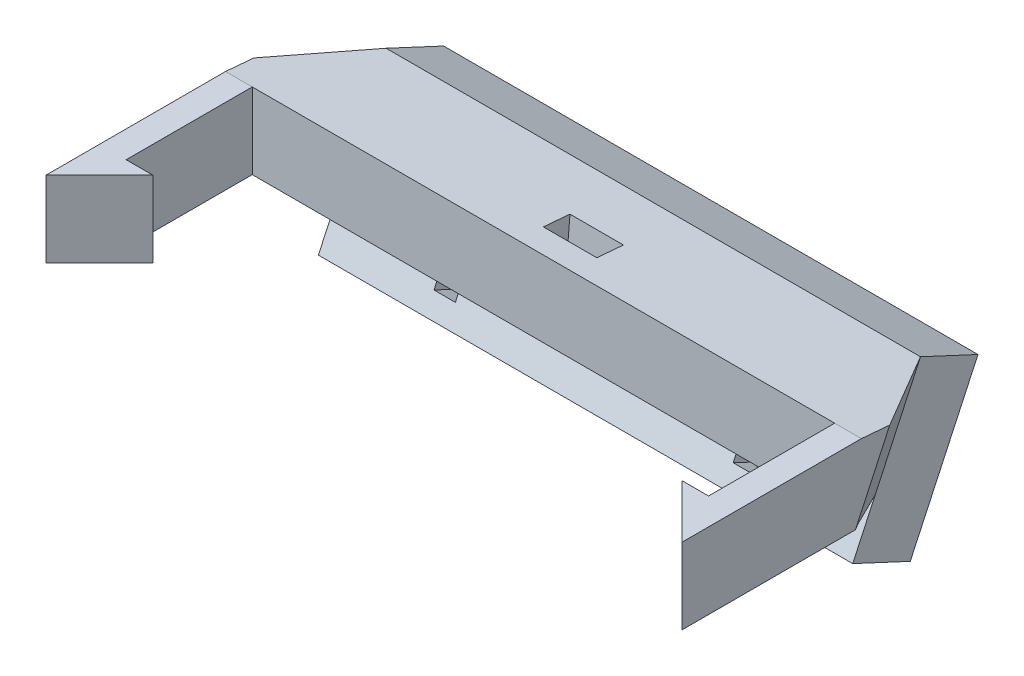
ISO-10303-21;
HEADER;
FILE_DESCRIPTION(('STEP AP214'),'2;1');
FILE_NAME('part.step','',(''),(''),'','','');
FILE_SCHEMA(('AUTOMOTIVE_DESIGN { 1 0 10303 214 1 1 1 1 }'));
ENDSEC;
DATA;
#1=APPLICATION_CONTEXT('core data for automotive mechanical design processes');
#2=APPLICATION_PROTOCOL_DEFINITION('international standard','automotive_design',2000,#1);
#3=PRODUCT_CONTEXT('',#1,'mechanical');
#4=PRODUCT('Part','Part','',(#3));
#5=PRODUCT_RELATED_PRODUCT_CATEGORY('part','',(#4));
#6=PRODUCT_DEFINITION_FORMATION('','',#4);
#7=PRODUCT_DEFINITION_CONTEXT('part definition',#1,'design');
#8=PRODUCT_DEFINITION('design','',#6,#7);
#9=PRODUCT_DEFINITION_SHAPE('','',#8);
#10=(LENGTH_UNIT() NAMED_UNIT(*) SI_UNIT(.MILLI.,.METRE.));
#11=(NAMED_UNIT(*) PLANE_ANGLE_UNIT() SI_UNIT($,.RADIAN.));
#12=(NAMED_UNIT(*) SI_UNIT($,.STERADIAN.) SOLID_ANGLE_UNIT());
#13=UNCERTAINTY_MEASURE_WITH_UNIT(LENGTH_MEASURE(1.E-05),#10,'distance_accuracy_value','');
#14=(GEOMETRIC_REPRESENTATION_CONTEXT(3) GLOBAL_UNCERTAINTY_ASSIGNED_CONTEXT((#13)) GLOBAL_UNIT_ASSIGNED_CONTEXT((#10,
#11,#12)) REPRESENTATION_CONTEXT('',''));
#15=CARTESIAN_POINT('',(0.,0.,0.));
#16=DIRECTION('',(0.,0.,1.));
#17=DIRECTION('',(1.,0.,0.));
#18=AXIS2_PLACEMENT_3D('',#15,#16,#17);
#19=CARTESIAN_POINT('',(37.7825,3.39860036747243,-13.0507435403567));
#20=DIRECTION('',(0.,-0.996366443360063,0.0851698922508354));
#21=DIRECTION('',(0.,-0.0851698922508354,-0.996366443360063));
#22=AXIS2_PLACEMENT_3D('',#19,#20,#21);
#23=PLANE('',#22);
#24=DIRECTION('',(0.,0.0851698922508354,0.996366443360063));
#25=VECTOR('',#24,1.);
#26=CARTESIAN_POINT('',(37.7825,3.39860036747243,-13.0507435403567));
#27=LINE('',#26,#25);
#28=CARTESIAN_POINT('',(37.7825,4.22620582678409,-3.36893831309177));
#29=VERTEX_POINT('',#28);
#30=CARTESIAN_POINT('',(37.7825,4.51418432609816,0.));
#31=VERTEX_POINT('',#30);
#32=EDGE_CURVE('E332',#29,#31,#27,.T.);
#33=ORIENTED_EDGE('',*,*,#32,.F.);
#34=DIRECTION('',(-0.527437876420652,-0.0723597954369629,-0.846506554328549));
#35=VECTOR('',#34,1.);
#36=CARTESIAN_POINT('',(33.428185479087,3.62883252068087,-10.3573552363792));
#37=LINE('',#36,#35);
#38=CARTESIAN_POINT('',(31.75,3.39860036747242,-13.0507435403567));
#39=VERTEX_POINT('',#38);
#40=EDGE_CURVE('E384',#29,#39,#37,.T.);
#41=ORIENTED_EDGE('',*,*,#40,.T.);
#42=DIRECTION('',(1.,0.,0.));
#43=VECTOR('',#42,1.);
#44=CARTESIAN_POINT('',(37.7825,3.39860036747242,-13.0507435403567));
#45=LINE('',#44,#43);
#46=CARTESIAN_POINT('',(-31.75,3.39860036747242,-13.0507435403567));
#47=VERTEX_POINT('',#46);
#48=EDGE_CURVE('E324',#47,#39,#45,.T.);
#49=ORIENTED_EDGE('',*,*,#48,.F.);
#50=DIRECTION('',(-0.527437876420653,0.0723597954369629,0.846506554328549));
#51=VECTOR('',#50,1.);
#52=CARTESIAN_POINT('',(-12.4067042147344,0.744871864701444,-44.0955876756763));
#53=LINE('',#52,#51);
#54=CARTESIAN_POINT('',(-37.7825,4.22620582678409,-3.36893831309177));
#55=VERTEX_POINT('',#54);
#56=EDGE_CURVE('E369',#47,#55,#53,.T.);
#57=ORIENTED_EDGE('',*,*,#56,.T.);
#58=DIRECTION('',(0.,0.0851698922508354,0.996366443360063));
#59=VECTOR('',#58,1.);
#60=CARTESIAN_POINT('',(-37.7825,3.39860036747243,-13.0507435403567));
#61=LINE('',#60,#59);
#62=CARTESIAN_POINT('',(-37.7825,4.51418432609816,0.));
#63=VERTEX_POINT('',#62);
#64=EDGE_CURVE('E333',#55,#63,#61,.T.);
#65=ORIENTED_EDGE('',*,*,#64,.T.);
#66=DIRECTION('',(-1.,0.,0.));
#67=VECTOR('',#66,1.);
#68=CARTESIAN_POINT('',(-37.7825,4.51418432609816,0.));
#69=LINE('',#68,#67);
#70=CARTESIAN_POINT('',(-34.6075,4.51418432609816,0.));
#71=VERTEX_POINT('',#70);
#72=EDGE_CURVE('E257',#71,#63,#69,.T.);
#73=ORIENTED_EDGE('',*,*,#72,.F.);
#74=DIRECTION('',(-1.,0.,0.));
#75=VECTOR('',#74,1.);
#76=CARTESIAN_POINT('',(37.7825,4.51418432609816,0.));
#77=LINE('',#76,#75);
#78=CARTESIAN_POINT('',(34.6075,4.51418432609816,0.));
#79=VERTEX_POINT('',#78);
#80=EDGE_CURVE('E327',#79,#71,#77,.T.);
#81=ORIENTED_EDGE('',*,*,#80,.F.);
#82=DIRECTION('',(-1.,0.,0.));
#83=VECTOR('',#82,1.);
#84=CARTESIAN_POINT('',(37.7825,4.51418432609816,0.));
#85=LINE('',#84,#83);
#86=EDGE_CURVE('E286',#31,#79,#85,.T.);
#87=ORIENTED_EDGE('',*,*,#86,.F.);
#88=EDGE_LOOP('',(#33,#41,#49,#57,#65,#73,#81,#87));
#89=FACE_BOUND('',#88,.T.);
#90=DIRECTION('',(0.,0.0851698922508354,0.996366443360063));
#91=VECTOR('',#90,1.);
#92=CARTESIAN_POINT('',(-3.175,3.39860036747242,-13.0507435403567));
#93=LINE('',#92,#91);
#94=CARTESIAN_POINT('',(-3.175,3.97335551030536,-6.3269269153364));
#95=VERTEX_POINT('',#94);
#96=CARTESIAN_POINT('',(-3.175,4.24376991820176,-3.1634634576682));
#97=VERTEX_POINT('',#96);
#98=EDGE_CURVE('E339',#95,#97,#93,.T.);
#99=ORIENTED_EDGE('',*,*,#98,.F.);
#100=DIRECTION('',(-1.,0.,0.));
#101=VECTOR('',#100,1.);
#102=CARTESIAN_POINT('',(37.7825,3.97335551030536,-6.3269269153364));
#103=LINE('',#102,#101);
#104=CARTESIAN_POINT('',(3.175,3.97335551030536,-6.3269269153364));
#105=VERTEX_POINT('',#104);
#106=EDGE_CURVE('E347',#105,#95,#103,.T.);
#107=ORIENTED_EDGE('',*,*,#106,.F.);
#108=DIRECTION('',(0.,-0.0851698922508354,-0.996366443360063));
#109=VECTOR('',#108,1.);
#110=CARTESIAN_POINT('',(3.175,3.39860036747243,-13.0507435403567));
#111=LINE('',#110,#109);
#112=CARTESIAN_POINT('',(3.175,4.24376991820176,-3.1634634576682));
#113=VERTEX_POINT('',#112);
#114=EDGE_CURVE('E344',#113,#105,#111,.T.);
#115=ORIENTED_EDGE('',*,*,#114,.F.);
#116=DIRECTION('',(1.,0.,0.));
#117=VECTOR('',#116,1.);
#118=CARTESIAN_POINT('',(37.7825,4.24376991820176,-3.1634634576682));
#119=LINE('',#118,#117);
#120=EDGE_CURVE('E342',#97,#113,#119,.T.);
#121=ORIENTED_EDGE('',*,*,#120,.F.);
#122=EDGE_LOOP('',(#99,#107,#115,#121));
#123=FACE_BOUND('',#122,.T.);
#124=ADVANCED_FACE('F33',(#89,#123),#23,.F.);
#125=CARTESIAN_POINT('',(37.7825,-8.09963674271568,-7.68902752059396));
#126=DIRECTION('',(0.,0.906307787036649,-0.422618261740701));
#127=DIRECTION('',(0.,0.422618261740701,0.906307787036649));
#128=AXIS2_PLACEMENT_3D('',#125,#126,#127);
#129=PLANE('',#128);
#130=DIRECTION('',(-1.,0.,0.));
#131=VECTOR('',#130,1.);
#132=CARTESIAN_POINT('',(37.7825,-8.09963674271568,-7.68902752059396));
#133=LINE('',#132,#131);
#134=CARTESIAN_POINT('',(31.75,-8.09963674271568,-7.68902752059396));
#135=VERTEX_POINT('',#134);
#136=CARTESIAN_POINT('',(-31.75,-8.09963674271568,-7.68902752059397));
#137=VERTEX_POINT('',#136);
#138=EDGE_CURVE('E241',#135,#137,#133,.T.);
#139=ORIENTED_EDGE('',*,*,#138,.F.);
#140=DIRECTION('',(0.551501692364503,0.352537069873648,0.756018186080198));
#141=VECTOR('',#140,1.);
#142=CARTESIAN_POINT('',(33.5848097088776,-6.9267691930801,-5.17380494355938));
#143=LINE('',#142,#141);
#144=CARTESIAN_POINT('',(37.3590075190268,-4.51418432609816,0.));
#145=VERTEX_POINT('',#144);
#146=EDGE_CURVE('E387',#135,#145,#143,.T.);
#147=ORIENTED_EDGE('',*,*,#146,.T.);
#148=DIRECTION('',(1.,0.,0.));
#149=VECTOR('',#148,1.);
#150=CARTESIAN_POINT('',(37.7825,-4.51418432609816,0.));
#151=LINE('',#150,#149);
#152=CARTESIAN_POINT('',(34.6075,-4.51418432609816,0.));
#153=VERTEX_POINT('',#152);
#154=EDGE_CURVE('E280',#153,#145,#151,.T.);
#155=ORIENTED_EDGE('',*,*,#154,.F.);
#156=DIRECTION('',(-1.,0.,0.));
#157=VECTOR('',#156,1.);
#158=CARTESIAN_POINT('',(37.7825,-4.51418432609816,0.));
#159=LINE('',#158,#157);
#160=CARTESIAN_POINT('',(-34.6075,-4.51418432609816,0.));
#161=VERTEX_POINT('',#160);
#162=EDGE_CURVE('E336',#153,#161,#159,.T.);
#163=ORIENTED_EDGE('',*,*,#162,.T.);
#164=DIRECTION('',(1.,0.,0.));
#165=VECTOR('',#164,1.);
#166=CARTESIAN_POINT('',(-37.7825,-4.51418432609816,0.));
#167=LINE('',#166,#165);
#168=CARTESIAN_POINT('',(-37.3590075190268,-4.51418432609816,0.));
#169=VERTEX_POINT('',#168);
#170=EDGE_CURVE('E263',#169,#161,#167,.T.);
#171=ORIENTED_EDGE('',*,*,#170,.F.);
#172=DIRECTION('',(0.551501692364503,-0.352537069873648,-0.756018186080197));
#173=VECTOR('',#172,1.);
#174=CARTESIAN_POINT('',(-10.6014038818846,-21.6184784990415,-36.6802772243083));
#175=LINE('',#174,#173);
#176=EDGE_CURVE('E372',#169,#137,#175,.T.);
#177=ORIENTED_EDGE('',*,*,#176,.T.);
#178=EDGE_LOOP('',(#139,#147,#155,#163,#171,#177));
#179=FACE_BOUND('',#178,.T.);
#180=DIRECTION('',(0.,-0.422618261740701,-0.906307787036649));
#181=VECTOR('',#180,1.);
#182=CARTESIAN_POINT('',(-3.175,-9.3759769667585,-10.4261479639785));
#183=LINE('',#182,#181);
#184=CARTESIAN_POINT('',(-3.175,-5.59707350368473,-2.32226333547929));
#185=VERTEX_POINT('',#184);
#186=CARTESIAN_POINT('',(-3.175,-7.02604059032113,-5.38669314195141));
#187=VERTEX_POINT('',#186);
#188=EDGE_CURVE('E361',#185,#187,#183,.T.);
#189=ORIENTED_EDGE('',*,*,#188,.F.);
#190=DIRECTION('',(-1.,0.,0.));
#191=VECTOR('',#190,1.);
#192=CARTESIAN_POINT('',(-3.175,-5.59707350368473,-2.32226333547929));
#193=LINE('',#192,#191);
#194=CARTESIAN_POINT('',(3.175,-5.59707350368473,-2.32226333547929));
#195=VERTEX_POINT('',#194);
#196=EDGE_CURVE('E358',#195,#185,#193,.T.);
#197=ORIENTED_EDGE('',*,*,#196,.F.);
#198=DIRECTION('',(0.,0.422618261740701,0.906307787036649));
#199=VECTOR('',#198,1.);
#200=CARTESIAN_POINT('',(3.175,-9.3759769667585,-10.4261479639785));
#201=LINE('',#200,#199);
#202=CARTESIAN_POINT('',(3.175,-7.02604059032113,-5.38669314195141));
#203=VERTEX_POINT('',#202);
#204=EDGE_CURVE('E366',#203,#195,#201,.T.);
#205=ORIENTED_EDGE('',*,*,#204,.F.);
#206=DIRECTION('',(1.,0.,0.));
#207=VECTOR('',#206,1.);
#208=CARTESIAN_POINT('',(-3.175,-7.02604059032113,-5.38669314195141));
#209=LINE('',#208,#207);
#210=EDGE_CURVE('E363',#187,#203,#209,.T.);
#211=ORIENTED_EDGE('',*,*,#210,.F.);
#212=EDGE_LOOP('',(#189,#197,#205,#211));
#213=FACE_BOUND('',#212,.T.);
#214=ADVANCED_FACE('F495',(#179,#213),#129,.F.);
#215=CARTESIAN_POINT('',(0.,0.,0.));
#216=DIRECTION('',(0.,0.,1.));
#217=DIRECTION('',(1.,0.,0.));
#218=AXIS2_PLACEMENT_3D('',#215,#216,#217);
#219=PLANE('',#218);
#220=ORIENTED_EDGE('',*,*,#162,.F.);
#221=DIRECTION('',(0.,-1.,0.));
#222=VECTOR('',#221,1.);
#223=CARTESIAN_POINT('',(34.6075,4.51418432609816,0.));
#224=LINE('',#223,#222);
#225=EDGE_CURVE('E283',#79,#153,#224,.T.);
#226=ORIENTED_EDGE('',*,*,#225,.F.);
#227=ORIENTED_EDGE('',*,*,#80,.T.);
#228=DIRECTION('',(0.,1.,0.));
#229=VECTOR('',#228,1.);
#230=CARTESIAN_POINT('',(-34.6075,4.51418432609816,0.));
#231=LINE('',#230,#229);
#232=EDGE_CURVE('E260',#161,#71,#231,.T.);
#233=ORIENTED_EDGE('',*,*,#232,.F.);
#234=EDGE_LOOP('',(#220,#226,#227,#233));
#235=FACE_BOUND('',#234,.T.);
#236=ADVANCED_FACE('F501',(#235),#219,.T.);
#237=CARTESIAN_POINT('',(-37.7825,17.78,-3.175));
#238=DIRECTION('',(-1.,0.,0.));
#239=DIRECTION('',(0.,0.,1.));
#240=AXIS2_PLACEMENT_3D('',#237,#238,#239);
#241=PLANE('',#240);
#242=DIRECTION('',(0.,0.906307787036649,-0.422618261740701));
#243=VECTOR('',#242,1.);
#244=CARTESIAN_POINT('',(-37.7825,-25.9312942503124,10.6937349236683));
#245=LINE('',#244,#243);
#246=CARTESIAN_POINT('',(-37.7825,-4.51418432609816,0.706772550459773));
#247=VERTEX_POINT('',#246);
#248=EDGE_CURVE('E377',#247,#55,#245,.T.);
#249=ORIENTED_EDGE('',*,*,#248,.F.);
#250=DIRECTION('',(0.,0.,-1.));
#251=VECTOR('',#250,1.);
#252=CARTESIAN_POINT('',(-37.7825,-4.51418432609816,14.986));
#253=LINE('',#252,#251);
#254=CARTESIAN_POINT('',(-37.7825,-4.51418432609816,21.336));
#255=VERTEX_POINT('',#254);
#256=EDGE_CURVE('E243',#255,#247,#253,.T.);
#257=ORIENTED_EDGE('',*,*,#256,.F.);
#258=DIRECTION('',(0.,-1.,0.));
#259=VECTOR('',#258,1.);
#260=CARTESIAN_POINT('',(-37.7825,13.4944404471673,21.336));
#261=LINE('',#260,#259);
#262=CARTESIAN_POINT('',(-37.7825,4.51418432609816,21.336));
#263=VERTEX_POINT('',#262);
#264=EDGE_CURVE('E298',#263,#255,#261,.T.);
#265=ORIENTED_EDGE('',*,*,#264,.F.);
#266=DIRECTION('',(0.,0.,-1.));
#267=VECTOR('',#266,1.);
#268=CARTESIAN_POINT('',(-37.7825,4.51418432609816,14.986));
#269=LINE('',#268,#267);
#270=EDGE_CURVE('E253',#263,#63,#269,.T.);
#271=ORIENTED_EDGE('',*,*,#270,.T.);
#272=ORIENTED_EDGE('',*,*,#64,.F.);
#273=EDGE_LOOP('',(#249,#257,#265,#271,#272));
#274=FACE_BOUND('',#273,.T.);
#275=ADVANCED_FACE('F35',(#274),#241,.T.);
#276=CARTESIAN_POINT('',(37.7825,17.78,-3.175));
#277=DIRECTION('',(1.,0.,0.));
#278=DIRECTION('',(0.,0.,-1.));
#279=AXIS2_PLACEMENT_3D('',#276,#277,#278);
#280=PLANE('',#279);
#281=DIRECTION('',(0.,0.906307787036649,-0.422618261740701));
#282=VECTOR('',#281,1.);
#283=CARTESIAN_POINT('',(37.7825,-25.9312942503124,10.6937349236683));
#284=LINE('',#283,#282);
#285=CARTESIAN_POINT('',(37.7825,-4.51418432609816,0.706772550459773));
#286=VERTEX_POINT('',#285);
#287=EDGE_CURVE('E394',#286,#29,#284,.T.);
#288=ORIENTED_EDGE('',*,*,#287,.T.);
#289=ORIENTED_EDGE('',*,*,#32,.T.);
#290=DIRECTION('',(0.,0.,-1.));
#291=VECTOR('',#290,1.);
#292=CARTESIAN_POINT('',(37.7825,4.51418432609816,14.986));
#293=LINE('',#292,#291);
#294=CARTESIAN_POINT('',(37.7825,4.51418432609816,21.336));
#295=VERTEX_POINT('',#294);
#296=EDGE_CURVE('E265',#295,#31,#293,.T.);
#297=ORIENTED_EDGE('',*,*,#296,.F.);
#298=DIRECTION('',(0.,-1.,0.));
#299=VECTOR('',#298,1.);
#300=CARTESIAN_POINT('',(37.7825,13.4944404471673,21.336));
#301=LINE('',#300,#299);
#302=CARTESIAN_POINT('',(37.7825,-4.51418432609816,21.336));
#303=VERTEX_POINT('',#302);
#304=EDGE_CURVE('E311',#295,#303,#301,.T.);
#305=ORIENTED_EDGE('',*,*,#304,.T.);
#306=DIRECTION('',(0.,0.,-1.));
#307=VECTOR('',#306,1.);
#308=CARTESIAN_POINT('',(37.7825,-4.51418432609816,14.986));
#309=LINE('',#308,#307);
#310=EDGE_CURVE('E276',#303,#286,#309,.T.);
#311=ORIENTED_EDGE('',*,*,#310,.T.);
#312=EDGE_LOOP('',(#288,#289,#297,#305,#311));
#313=FACE_BOUND('',#312,.T.);
#314=ADVANCED_FACE('F553',(#313),#280,.T.);
#315=CARTESIAN_POINT('',(-37.7825,-4.51418432609816,14.986));
#316=DIRECTION('',(0.,1.,0.));
#317=DIRECTION('',(0.,0.,1.));
#318=AXIS2_PLACEMENT_3D('',#315,#316,#317);
#319=PLANE('',#318);
#320=ORIENTED_EDGE('',*,*,#256,.T.);
#321=DIRECTION('',(0.513986051768902,0.,-0.857798541959017));
#322=VECTOR('',#321,1.);
#323=CARTESIAN_POINT('',(-44.0781612023646,-4.51418432609816,11.2136899686866));
#324=LINE('',#323,#322);
#325=EDGE_CURVE('E374',#247,#169,#324,.T.);
#326=ORIENTED_EDGE('',*,*,#325,.T.);
#327=ORIENTED_EDGE('',*,*,#170,.T.);
#328=DIRECTION('',(0.,0.,-1.));
#329=VECTOR('',#328,1.);
#330=CARTESIAN_POINT('',(-34.6075,-4.51418432609816,14.986));
#331=LINE('',#330,#329);
#332=CARTESIAN_POINT('',(-34.6075,-4.51418432609816,14.986));
#333=VERTEX_POINT('',#332);
#334=EDGE_CURVE('E245',#333,#161,#331,.T.);
#335=ORIENTED_EDGE('',*,*,#334,.F.);
#336=DIRECTION('',(1.,0.,0.));
#337=VECTOR('',#336,1.);
#338=CARTESIAN_POINT('',(-37.7825,-4.51418432609816,14.986));
#339=LINE('',#338,#337);
#340=CARTESIAN_POINT('',(-31.4325,-4.51418432609816,14.986));
#341=VERTEX_POINT('',#340);
#342=EDGE_CURVE('E304',#333,#341,#339,.T.);
#343=ORIENTED_EDGE('',*,*,#342,.T.);
#344=DIRECTION('',(-0.707106781186547,0.,0.707106781186547));
#345=VECTOR('',#344,1.);
#346=CARTESIAN_POINT('',(-31.4325,-4.51418432609816,14.986));
#347=LINE('',#346,#345);
#348=EDGE_CURVE('E299',#341,#255,#347,.T.);
#349=ORIENTED_EDGE('',*,*,#348,.T.);
#350=EDGE_LOOP('',(#320,#326,#327,#335,#343,#349));
#351=FACE_BOUND('',#350,.T.);
#352=ADVANCED_FACE('F549',(#351),#319,.F.);
#353=CARTESIAN_POINT('',(-34.6075,4.51418432609816,14.986));
#354=DIRECTION('',(-1.,0.,0.));
#355=DIRECTION('',(0.,0.,1.));
#356=AXIS2_PLACEMENT_3D('',#353,#354,#355);
#357=PLANE('',#356);
#358=ORIENTED_EDGE('',*,*,#232,.T.);
#359=DIRECTION('',(0.,0.,-1.));
#360=VECTOR('',#359,1.);
#361=CARTESIAN_POINT('',(-34.6075,4.51418432609816,14.986));
#362=LINE('',#361,#360);
#363=CARTESIAN_POINT('',(-34.6075,4.51418432609816,14.986));
#364=VERTEX_POINT('',#363);
#365=EDGE_CURVE('E250',#364,#71,#362,.T.);
#366=ORIENTED_EDGE('',*,*,#365,.F.);
#367=DIRECTION('',(0.,1.,0.));
#368=VECTOR('',#367,1.);
#369=CARTESIAN_POINT('',(-34.6075,4.51418432609816,14.986));
#370=LINE('',#369,#368);
#371=EDGE_CURVE('E256',#333,#364,#370,.T.);
#372=ORIENTED_EDGE('',*,*,#371,.F.);
#373=ORIENTED_EDGE('',*,*,#334,.T.);
#374=EDGE_LOOP('',(#358,#366,#372,#373));
#375=FACE_BOUND('',#374,.T.);
#376=ADVANCED_FACE('F545',(#375),#357,.F.);
#377=CARTESIAN_POINT('',(-37.7825,4.51418432609816,14.986));
#378=DIRECTION('',(0.,-1.,0.));
#379=DIRECTION('',(0.,0.,-1.));
#380=AXIS2_PLACEMENT_3D('',#377,#378,#379);
#381=PLANE('',#380);
#382=ORIENTED_EDGE('',*,*,#72,.T.);
#383=ORIENTED_EDGE('',*,*,#270,.F.);
#384=DIRECTION('',(0.707106781186548,0.,-0.707106781186548));
#385=VECTOR('',#384,1.);
#386=CARTESIAN_POINT('',(-31.4325,4.51418432609816,14.986));
#387=LINE('',#386,#385);
#388=CARTESIAN_POINT('',(-31.4325,4.51418432609816,14.986));
#389=VERTEX_POINT('',#388);
#390=EDGE_CURVE('E294',#263,#389,#387,.T.);
#391=ORIENTED_EDGE('',*,*,#390,.T.);
#392=DIRECTION('',(-1.,0.,0.));
#393=VECTOR('',#392,1.);
#394=CARTESIAN_POINT('',(-37.7825,4.51418432609816,14.986));
#395=LINE('',#394,#393);
#396=EDGE_CURVE('E289',#389,#364,#395,.T.);
#397=ORIENTED_EDGE('',*,*,#396,.T.);
#398=ORIENTED_EDGE('',*,*,#365,.T.);
#399=EDGE_LOOP('',(#382,#383,#391,#397,#398));
#400=FACE_BOUND('',#399,.T.);
#401=ADVANCED_FACE('F541',(#400),#381,.F.);
#402=CARTESIAN_POINT('',(37.7825,4.51418432609816,14.986));
#403=DIRECTION('',(0.,-1.,0.));
#404=DIRECTION('',(1.,0.,0.));
#405=AXIS2_PLACEMENT_3D('',#402,#403,#404);
#406=PLANE('',#405);
#407=ORIENTED_EDGE('',*,*,#86,.T.);
#408=DIRECTION('',(0.,0.,-1.));
#409=VECTOR('',#408,1.);
#410=CARTESIAN_POINT('',(34.6075,4.51418432609816,14.986));
#411=LINE('',#410,#409);
#412=CARTESIAN_POINT('',(34.6075,4.51418432609816,14.986));
#413=VERTEX_POINT('',#412);
#414=EDGE_CURVE('E270',#413,#79,#411,.T.);
#415=ORIENTED_EDGE('',*,*,#414,.F.);
#416=DIRECTION('',(-1.,0.,0.));
#417=VECTOR('',#416,1.);
#418=CARTESIAN_POINT('',(37.7825,4.51418432609816,14.986));
#419=LINE('',#418,#417);
#420=CARTESIAN_POINT('',(31.4325,4.51418432609816,14.986));
#421=VERTEX_POINT('',#420);
#422=EDGE_CURVE('E310',#413,#421,#419,.T.);
#423=ORIENTED_EDGE('',*,*,#422,.T.);
#424=DIRECTION('',(0.707106781186548,0.,0.707106781186548));
#425=VECTOR('',#424,1.);
#426=CARTESIAN_POINT('',(31.4325,4.51418432609816,14.986));
#427=LINE('',#426,#425);
#428=EDGE_CURVE('E306',#421,#295,#427,.T.);
#429=ORIENTED_EDGE('',*,*,#428,.T.);
#430=ORIENTED_EDGE('',*,*,#296,.T.);
#431=EDGE_LOOP('',(#407,#415,#423,#429,#430));
#432=FACE_BOUND('',#431,.T.);
#433=ADVANCED_FACE('F537',(#432),#406,.F.);
#434=CARTESIAN_POINT('',(34.6075,4.51418432609816,14.986));
#435=DIRECTION('',(1.,0.,0.));
#436=DIRECTION('',(0.,0.,-1.));
#437=AXIS2_PLACEMENT_3D('',#434,#435,#436);
#438=PLANE('',#437);
#439=ORIENTED_EDGE('',*,*,#225,.T.);
#440=DIRECTION('',(0.,0.,-1.));
#441=VECTOR('',#440,1.);
#442=CARTESIAN_POINT('',(34.6075,-4.51418432609816,14.986));
#443=LINE('',#442,#441);
#444=CARTESIAN_POINT('',(34.6075,-4.51418432609816,14.986));
#445=VERTEX_POINT('',#444);
#446=EDGE_CURVE('E273',#445,#153,#443,.T.);
#447=ORIENTED_EDGE('',*,*,#446,.F.);
#448=DIRECTION('',(0.,-1.,0.));
#449=VECTOR('',#448,1.);
#450=CARTESIAN_POINT('',(34.6075,4.51418432609816,14.986));
#451=LINE('',#450,#449);
#452=EDGE_CURVE('E279',#413,#445,#451,.T.);
#453=ORIENTED_EDGE('',*,*,#452,.F.);
#454=ORIENTED_EDGE('',*,*,#414,.T.);
#455=EDGE_LOOP('',(#439,#447,#453,#454));
#456=FACE_BOUND('',#455,.T.);
#457=ADVANCED_FACE('F533',(#456),#438,.F.);
#458=CARTESIAN_POINT('',(37.7825,-4.51418432609816,14.986));
#459=DIRECTION('',(0.,1.,0.));
#460=DIRECTION('',(-1.,0.,0.));
#461=AXIS2_PLACEMENT_3D('',#458,#459,#460);
#462=PLANE('',#461);
#463=ORIENTED_EDGE('',*,*,#154,.T.);
#464=DIRECTION('',(0.513986051768902,0.,0.857798541959017));
#465=VECTOR('',#464,1.);
#466=CARTESIAN_POINT('',(44.0781612023646,-4.51418432609816,11.2136899686866));
#467=LINE('',#466,#465);
#468=EDGE_CURVE('E390',#145,#286,#467,.T.);
#469=ORIENTED_EDGE('',*,*,#468,.T.);
#470=ORIENTED_EDGE('',*,*,#310,.F.);
#471=DIRECTION('',(-0.707106781186547,0.,-0.707106781186548));
#472=VECTOR('',#471,1.);
#473=CARTESIAN_POINT('',(31.4325,-4.51418432609816,14.986));
#474=LINE('',#473,#472);
#475=CARTESIAN_POINT('',(31.4325,-4.51418432609816,14.986));
#476=VERTEX_POINT('',#475);
#477=EDGE_CURVE('E319',#303,#476,#474,.T.);
#478=ORIENTED_EDGE('',*,*,#477,.T.);
#479=DIRECTION('',(1.,0.,0.));
#480=VECTOR('',#479,1.);
#481=CARTESIAN_POINT('',(37.7825,-4.51418432609816,14.986));
#482=LINE('',#481,#480);
#483=EDGE_CURVE('E315',#476,#445,#482,.T.);
#484=ORIENTED_EDGE('',*,*,#483,.T.);
#485=ORIENTED_EDGE('',*,*,#446,.T.);
#486=EDGE_LOOP('',(#463,#469,#470,#478,#484,#485));
#487=FACE_BOUND('',#486,.T.);
#488=ADVANCED_FACE('F526',(#487),#462,.F.);
#489=CARTESIAN_POINT('',(-31.4325,13.4944404471673,14.986));
#490=DIRECTION('',(0.707106781186548,0.,0.707106781186548));
#491=DIRECTION('',(0.707106781186548,0.,-0.707106781186548));
#492=AXIS2_PLACEMENT_3D('',#489,#490,#491);
#493=PLANE('',#492);
#494=ORIENTED_EDGE('',*,*,#390,.F.);
#495=ORIENTED_EDGE('',*,*,#264,.T.);
#496=ORIENTED_EDGE('',*,*,#348,.F.);
#497=DIRECTION('',(0.,-1.,0.));
#498=VECTOR('',#497,1.);
#499=CARTESIAN_POINT('',(-31.4325,13.4944404471673,14.986));
#500=LINE('',#499,#498);
#501=EDGE_CURVE('E295',#389,#341,#500,.T.);
#502=ORIENTED_EDGE('',*,*,#501,.F.);
#503=EDGE_LOOP('',(#494,#495,#496,#502));
#504=FACE_BOUND('',#503,.T.);
#505=ADVANCED_FACE('F523',(#504),#493,.T.);
#506=CARTESIAN_POINT('',(-37.7825,13.4944404471673,14.986));
#507=DIRECTION('',(0.,0.,-1.));
#508=DIRECTION('',(-1.,0.,0.));
#509=AXIS2_PLACEMENT_3D('',#506,#507,#508);
#510=PLANE('',#509);
#511=ORIENTED_EDGE('',*,*,#342,.F.);
#512=ORIENTED_EDGE('',*,*,#371,.T.);
#513=ORIENTED_EDGE('',*,*,#396,.F.);
#514=ORIENTED_EDGE('',*,*,#501,.T.);
#515=EDGE_LOOP('',(#511,#512,#513,#514));
#516=FACE_BOUND('',#515,.T.);
#517=ADVANCED_FACE('F518',(#516),#510,.T.);
#518=CARTESIAN_POINT('',(37.7825,13.4944404471673,14.986));
#519=DIRECTION('',(0.,0.,-1.));
#520=DIRECTION('',(-1.,0.,0.));
#521=AXIS2_PLACEMENT_3D('',#518,#519,#520);
#522=PLANE('',#521);
#523=ORIENTED_EDGE('',*,*,#422,.F.);
#524=ORIENTED_EDGE('',*,*,#452,.T.);
#525=ORIENTED_EDGE('',*,*,#483,.F.);
#526=DIRECTION('',(0.,-1.,0.));
#527=VECTOR('',#526,1.);
#528=CARTESIAN_POINT('',(31.4325,13.4944404471673,14.986));
#529=LINE('',#528,#527);
#530=EDGE_CURVE('E314',#421,#476,#529,.T.);
#531=ORIENTED_EDGE('',*,*,#530,.F.);
#532=EDGE_LOOP('',(#523,#524,#525,#531));
#533=FACE_BOUND('',#532,.T.);
#534=ADVANCED_FACE('F515',(#533),#522,.T.);
#535=CARTESIAN_POINT('',(31.4325,13.4944404471673,14.986));
#536=DIRECTION('',(-0.707106781186547,0.,0.707106781186547));
#537=DIRECTION('',(0.707106781186548,0.,0.707106781186548));
#538=AXIS2_PLACEMENT_3D('',#535,#536,#537);
#539=PLANE('',#538);
#540=ORIENTED_EDGE('',*,*,#428,.F.);
#541=ORIENTED_EDGE('',*,*,#530,.T.);
#542=ORIENTED_EDGE('',*,*,#477,.F.);
#543=ORIENTED_EDGE('',*,*,#304,.F.);
#544=EDGE_LOOP('',(#540,#541,#542,#543));
#545=FACE_BOUND('',#544,.T.);
#546=ADVANCED_FACE('F513',(#545),#539,.T.);
#547=CARTESIAN_POINT('',(37.7825,0.209875822369015,-19.8889853949296));
#548=DIRECTION('',(0.,-0.906307787036649,0.422618261740701));
#549=DIRECTION('',(0.,-0.422618261740701,-0.906307787036649));
#550=AXIS2_PLACEMENT_3D('',#547,#548,#549);
#551=PLANE('',#550);
#552=ORIENTED_EDGE('',*,*,#48,.T.);
#553=DIRECTION('',(0.,0.422618261740701,0.906307787036649));
#554=VECTOR('',#553,1.);
#555=CARTESIAN_POINT('',(31.75,0.209875822369015,-19.8889853949296));
#556=LINE('',#555,#554);
#557=CARTESIAN_POINT('',(31.75,0.209875822369015,-19.8889853949296));
#558=VERTEX_POINT('',#557);
#559=EDGE_CURVE('E398',#558,#39,#556,.T.);
#560=ORIENTED_EDGE('',*,*,#559,.F.);
#561=DIRECTION('',(1.,0.,0.));
#562=VECTOR('',#561,1.);
#563=CARTESIAN_POINT('',(37.7825,0.209875822369015,-19.8889853949296));
#564=LINE('',#563,#562);
#565=CARTESIAN_POINT('',(-31.75,0.209875822369015,-19.8889853949296));
#566=VERTEX_POINT('',#565);
#567=EDGE_CURVE('E322',#566,#558,#564,.T.);
#568=ORIENTED_EDGE('',*,*,#567,.F.);
#569=DIRECTION('',(0.,-0.422618261740701,-0.906307787036649));
#570=VECTOR('',#569,1.);
#571=CARTESIAN_POINT('',(-31.75,0.209875822369015,-19.8889853949296));
#572=LINE('',#571,#570);
#573=EDGE_CURVE('E380',#47,#566,#572,.T.);
#574=ORIENTED_EDGE('',*,*,#573,.F.);
#575=EDGE_LOOP('',(#552,#560,#568,#574));
#576=FACE_BOUND('',#575,.T.);
#577=ADVANCED_FACE('F510',(#576),#551,.F.);
#578=CARTESIAN_POINT('',(0.,-7.58043824844147,-16.256302284278));
#579=DIRECTION('',(0.,0.422618261740701,0.906307787036649));
#580=DIRECTION('',(0.,-0.906307787036649,0.422618261740701));
#581=AXIS2_PLACEMENT_3D('',#578,#579,#580);
#582=PLANE('',#581);
#583=DIRECTION('',(1.,0.,0.));
#584=VECTOR('',#583,1.);
#585=CARTESIAN_POINT('',(-19.05,-11.3668944018197,-14.4906487826897));
#586=LINE('',#585,#584);
#587=CARTESIAN_POINT('',(-19.05,-11.3668944018197,-14.4906487826897));
#588=VERTEX_POINT('',#587);
#589=CARTESIAN_POINT('',(-16.51,-11.3668944018197,-14.4906487826897));
#590=VERTEX_POINT('',#589);
#591=EDGE_CURVE('E451',#588,#590,#586,.T.);
#592=ORIENTED_EDGE('',*,*,#591,.F.);
#593=DIRECTION('',(0.,0.906307787036649,-0.422618261740701));
#594=VECTOR('',#593,1.);
#595=CARTESIAN_POINT('',(-19.05,-11.3668944018197,-14.4906487826897));
#596=LINE('',#595,#594);
#597=CARTESIAN_POINT('',(-19.05,-14.8199270704293,-12.8804732054576));
#598=VERTEX_POINT('',#597);
#599=EDGE_CURVE('E56',#598,#588,#596,.T.);
#600=ORIENTED_EDGE('',*,*,#599,.F.);
#601=DIRECTION('',(-1.,0.,0.));
#602=VECTOR('',#601,1.);
#603=CARTESIAN_POINT('',(-19.05,-14.8199270704293,-12.8804732054576));
#604=LINE('',#603,#602);
#605=CARTESIAN_POINT('',(-16.51,-14.8199270704293,-12.8804732054576));
#606=VERTEX_POINT('',#605);
#607=EDGE_CURVE('E441',#606,#598,#604,.T.);
#608=ORIENTED_EDGE('',*,*,#607,.F.);
#609=DIRECTION('',(0.,-0.906307787036649,0.422618261740701));
#610=VECTOR('',#609,1.);
#611=CARTESIAN_POINT('',(-16.51,-11.3668944018197,-14.4906487826897));
#612=LINE('',#611,#610);
#613=EDGE_CURVE('E448',#590,#606,#612,.T.);
#614=ORIENTED_EDGE('',*,*,#613,.F.);
#615=EDGE_LOOP('',(#592,#600,#608,#614));
#616=FACE_BOUND('',#615,.T.);
#617=DIRECTION('',(-1.,0.,0.));
#618=VECTOR('',#617,1.);
#619=CARTESIAN_POINT('',(19.05,-14.8199270704293,-12.8804732054576));
#620=LINE('',#619,#618);
#621=CARTESIAN_POINT('',(19.05,-14.8199270704293,-12.8804732054576));
#622=VERTEX_POINT('',#621);
#623=CARTESIAN_POINT('',(16.51,-14.8199270704293,-12.8804732054576));
#624=VERTEX_POINT('',#623);
#625=EDGE_CURVE('E421',#622,#624,#620,.T.);
#626=ORIENTED_EDGE('',*,*,#625,.F.);
#627=DIRECTION('',(0.,-0.906307787036649,0.422618261740701));
#628=VECTOR('',#627,1.);
#629=CARTESIAN_POINT('',(19.05,-11.3668944018197,-14.4906487826897));
#630=LINE('',#629,#628);
#631=CARTESIAN_POINT('',(19.05,-11.3668944018197,-14.4906487826897));
#632=VERTEX_POINT('',#631);
#633=EDGE_CURVE('E424',#632,#622,#630,.T.);
#634=ORIENTED_EDGE('',*,*,#633,.F.);
#635=DIRECTION('',(1.,0.,0.));
#636=VECTOR('',#635,1.);
#637=CARTESIAN_POINT('',(19.05,-11.3668944018197,-14.4906487826897));
#638=LINE('',#637,#636);
#639=CARTESIAN_POINT('',(16.51,-11.3668944018197,-14.4906487826897));
#640=VERTEX_POINT('',#639);
#641=EDGE_CURVE('E411',#640,#632,#638,.T.);
#642=ORIENTED_EDGE('',*,*,#641,.F.);
#643=DIRECTION('',(0.,0.906307787036649,-0.422618261740701));
#644=VECTOR('',#643,1.);
#645=CARTESIAN_POINT('',(16.51,-11.3668944018197,-14.4906487826897));
#646=LINE('',#645,#644);
#647=EDGE_CURVE('E418',#624,#640,#646,.T.);
#648=ORIENTED_EDGE('',*,*,#647,.F.);
#649=EDGE_LOOP('',(#626,#634,#642,#648));
#650=FACE_BOUND('',#649,.T.);
#651=DIRECTION('',(0.,0.906307787036649,-0.422618261740701));
#652=VECTOR('',#651,1.);
#653=CARTESIAN_POINT('',(31.75,-32.9761808044477,-4.4140730458795));
#654=LINE('',#653,#652);
#655=CARTESIAN_POINT('',(31.75,-17.0552875206792,-11.8381075087693));
#656=VERTEX_POINT('',#655);
#657=EDGE_CURVE('E397',#656,#558,#654,.T.);
#658=ORIENTED_EDGE('',*,*,#657,.F.);
#659=DIRECTION('',(1.,0.,0.));
#660=VECTOR('',#659,1.);
#661=CARTESIAN_POINT('',(65.0096747372082,-17.0552875206792,-11.8381075087693));
#662=LINE('',#661,#660);
#663=CARTESIAN_POINT('',(-31.75,-17.0552875206792,-11.8381075087693));
#664=VERTEX_POINT('',#663);
#665=EDGE_CURVE('E48',#664,#656,#662,.T.);
#666=ORIENTED_EDGE('',*,*,#665,.F.);
#667=DIRECTION('',(0.,0.906307787036649,-0.422618261740701));
#668=VECTOR('',#667,1.);
#669=CARTESIAN_POINT('',(-31.75,-32.9761808044477,-4.4140730458795));
#670=LINE('',#669,#668);
#671=EDGE_CURVE('E237',#664,#566,#670,.T.);
#672=ORIENTED_EDGE('',*,*,#671,.T.);
#673=ORIENTED_EDGE('',*,*,#567,.T.);
#674=EDGE_LOOP('',(#658,#666,#672,#673));
#675=FACE_BOUND('',#674,.T.);
#676=ADVANCED_FACE('F479',(#616,#650,#675),#582,.F.);
#677=CARTESIAN_POINT('',(37.7825,-17.78,-3.175));
#678=DIRECTION('',(0.,-0.422618261740701,-0.906307787036649));
#679=DIRECTION('',(0.,0.906307787036649,-0.422618261740701));
#680=AXIS2_PLACEMENT_3D('',#677,#678,#679);
#681=PLANE('',#680);
#682=DIRECTION('',(1.,0.,0.));
#683=VECTOR('',#682,1.);
#684=CARTESIAN_POINT('',(-19.05,-11.6312025253259,-6.04223135088467));
#685=LINE('',#684,#683);
#686=CARTESIAN_POINT('',(-19.05,-11.6312025253259,-6.04223135088467));
#687=VERTEX_POINT('',#686);
#688=CARTESIAN_POINT('',(-16.51,-11.6312025253259,-6.04223135088467));
#689=VERTEX_POINT('',#688);
#690=EDGE_CURVE('E458',#687,#689,#685,.T.);
#691=ORIENTED_EDGE('',*,*,#690,.F.);
#692=DIRECTION('',(0.,-0.906307787036649,0.422618261740701));
#693=VECTOR('',#692,1.);
#694=CARTESIAN_POINT('',(-19.05,-8.17816985671624,-7.65240692811674));
#695=LINE('',#694,#693);
#696=CARTESIAN_POINT('',(-19.05,-8.17816985671624,-7.65240692811674));
#697=VERTEX_POINT('',#696);
#698=EDGE_CURVE('E455',#697,#687,#695,.T.);
#699=ORIENTED_EDGE('',*,*,#698,.F.);
#700=DIRECTION('',(-1.,0.,0.));
#701=VECTOR('',#700,1.);
#702=CARTESIAN_POINT('',(-19.05,-8.17816985671624,-7.65240692811674));
#703=LINE('',#702,#701);
#704=CARTESIAN_POINT('',(-16.51,-8.17816985671624,-7.65240692811674));
#705=VERTEX_POINT('',#704);
#706=EDGE_CURVE('E434',#705,#697,#703,.T.);
#707=ORIENTED_EDGE('',*,*,#706,.F.);
#708=DIRECTION('',(0.,0.906307787036649,-0.422618261740701));
#709=VECTOR('',#708,1.);
#710=CARTESIAN_POINT('',(-16.51,-8.17816985671624,-7.65240692811674));
#711=LINE('',#710,#709);
#712=EDGE_CURVE('E461',#689,#705,#711,.T.);
#713=ORIENTED_EDGE('',*,*,#712,.F.);
#714=EDGE_LOOP('',(#691,#699,#707,#713));
#715=FACE_BOUND('',#714,.T.);
#716=DIRECTION('',(-1.,0.,0.));
#717=VECTOR('',#716,1.);
#718=CARTESIAN_POINT('',(19.05,-8.17816985671625,-7.65240692811674));
#719=LINE('',#718,#717);
#720=CARTESIAN_POINT('',(19.05,-8.17816985671625,-7.65240692811673));
#721=VERTEX_POINT('',#720);
#722=CARTESIAN_POINT('',(16.51,-8.17816985671625,-7.65240692811673));
#723=VERTEX_POINT('',#722);
#724=EDGE_CURVE('E429',#721,#723,#719,.T.);
#725=ORIENTED_EDGE('',*,*,#724,.F.);
#726=DIRECTION('',(0.,0.906307787036649,-0.422618261740701));
#727=VECTOR('',#726,1.);
#728=CARTESIAN_POINT('',(19.05,-8.17816985671625,-7.65240692811673));
#729=LINE('',#728,#727);
#730=CARTESIAN_POINT('',(19.05,-11.6312025253259,-6.04223135088467));
#731=VERTEX_POINT('',#730);
#732=EDGE_CURVE('E426',#731,#721,#729,.T.);
#733=ORIENTED_EDGE('',*,*,#732,.F.);
#734=DIRECTION('',(1.,0.,0.));
#735=VECTOR('',#734,1.);
#736=CARTESIAN_POINT('',(19.05,-11.6312025253259,-6.04223135088467));
#737=LINE('',#736,#735);
#738=CARTESIAN_POINT('',(16.51,-11.6312025253259,-6.04223135088467));
#739=VERTEX_POINT('',#738);
#740=EDGE_CURVE('E403',#739,#731,#737,.T.);
#741=ORIENTED_EDGE('',*,*,#740,.F.);
#742=DIRECTION('',(0.,-0.906307787036649,0.422618261740701));
#743=VECTOR('',#742,1.);
#744=CARTESIAN_POINT('',(16.51,-8.17816985671625,-7.65240692811673));
#745=LINE('',#744,#743);
#746=EDGE_CURVE('E432',#723,#739,#745,.T.);
#747=ORIENTED_EDGE('',*,*,#746,.F.);
#748=EDGE_LOOP('',(#725,#733,#741,#747));
#749=FACE_BOUND('',#748,.T.);
#750=DIRECTION('',(0.,-0.906307787036649,0.422618261740701));
#751=VECTOR('',#750,1.);
#752=CARTESIAN_POINT('',(-31.75,-17.78,-3.175));
#753=LINE('',#752,#751);
#754=CARTESIAN_POINT('',(-31.75,-13.8665629755757,-4.99986565419635));
#755=VERTEX_POINT('',#754);
#756=EDGE_CURVE('E41',#137,#755,#753,.T.);
#757=ORIENTED_EDGE('',*,*,#756,.T.);
#758=DIRECTION('',(-1.,0.,0.));
#759=VECTOR('',#758,1.);
#760=CARTESIAN_POINT('',(65.0096747372082,-13.8665629755757,-4.99986565419635));
#761=LINE('',#760,#759);
#762=CARTESIAN_POINT('',(31.75,-13.8665629755757,-4.99986565419635));
#763=VERTEX_POINT('',#762);
#764=EDGE_CURVE('E221',#763,#755,#761,.T.);
#765=ORIENTED_EDGE('',*,*,#764,.F.);
#766=DIRECTION('',(0.,0.906307787036649,-0.422618261740701));
#767=VECTOR('',#766,1.);
#768=CARTESIAN_POINT('',(31.75,-17.78,-3.175));
#769=LINE('',#768,#767);
#770=EDGE_CURVE('E11',#763,#135,#769,.T.);
#771=ORIENTED_EDGE('',*,*,#770,.T.);
#772=ORIENTED_EDGE('',*,*,#138,.T.);
#773=EDGE_LOOP('',(#757,#765,#771,#772));
#774=FACE_BOUND('',#773,.T.);
#775=ADVANCED_FACE('F239',(#715,#749,#774),#681,.F.);
#776=CARTESIAN_POINT('',(-3.175,5.66114321646822,-6.4711998362423));
#777=DIRECTION('',(1.,0.,0.));
#778=DIRECTION('',(0.,0.,-1.));
#779=AXIS2_PLACEMENT_3D('',#776,#777,#778);
#780=PLANE('',#779);
#781=ORIENTED_EDGE('',*,*,#98,.T.);
#782=DIRECTION('',(0.,-0.996366443360063,0.0851698922508354));
#783=VECTOR('',#782,1.);
#784=CARTESIAN_POINT('',(-3.175,5.93155762436462,-3.3077363785741));
#785=LINE('',#784,#783);
#786=EDGE_CURVE('E349',#97,#185,#785,.T.);
#787=ORIENTED_EDGE('',*,*,#786,.T.);
#788=ORIENTED_EDGE('',*,*,#188,.T.);
#789=DIRECTION('',(0.,-0.996366443360063,0.0851698922508354));
#790=VECTOR('',#789,1.);
#791=CARTESIAN_POINT('',(-3.175,5.66114321646822,-6.4711998362423));
#792=LINE('',#791,#790);
#793=EDGE_CURVE('E355',#95,#187,#792,.T.);
#794=ORIENTED_EDGE('',*,*,#793,.F.);
#795=EDGE_LOOP('',(#781,#787,#788,#794));
#796=FACE_BOUND('',#795,.T.);
#797=ADVANCED_FACE('F623',(#796),#780,.T.);
#798=CARTESIAN_POINT('',(-3.175,5.93155762436462,-3.3077363785741));
#799=DIRECTION('',(0.,-0.0851698922508353,-0.996366443360063));
#800=DIRECTION('',(0.,0.996366443360063,-0.0851698922508354));
#801=AXIS2_PLACEMENT_3D('',#798,#799,#800);
#802=PLANE('',#801);
#803=ORIENTED_EDGE('',*,*,#120,.T.);
#804=DIRECTION('',(0.,-0.996366443360063,0.0851698922508354));
#805=VECTOR('',#804,1.);
#806=CARTESIAN_POINT('',(3.175,5.93155762436462,-3.3077363785741));
#807=LINE('',#806,#805);
#808=EDGE_CURVE('E351',#113,#195,#807,.T.);
#809=ORIENTED_EDGE('',*,*,#808,.T.);
#810=ORIENTED_EDGE('',*,*,#196,.T.);
#811=ORIENTED_EDGE('',*,*,#786,.F.);
#812=EDGE_LOOP('',(#803,#809,#810,#811));
#813=FACE_BOUND('',#812,.T.);
#814=ADVANCED_FACE('F619',(#813),#802,.T.);
#815=CARTESIAN_POINT('',(3.175,5.66114321646822,-6.4711998362423));
#816=DIRECTION('',(-1.,0.,0.));
#817=DIRECTION('',(0.,0.,1.));
#818=AXIS2_PLACEMENT_3D('',#815,#816,#817);
#819=PLANE('',#818);
#820=ORIENTED_EDGE('',*,*,#114,.T.);
#821=DIRECTION('',(0.,-0.996366443360063,0.0851698922508354));
#822=VECTOR('',#821,1.);
#823=CARTESIAN_POINT('',(3.175,5.66114321646822,-6.4711998362423));
#824=LINE('',#823,#822);
#825=EDGE_CURVE('E353',#105,#203,#824,.T.);
#826=ORIENTED_EDGE('',*,*,#825,.T.);
#827=ORIENTED_EDGE('',*,*,#204,.T.);
#828=ORIENTED_EDGE('',*,*,#808,.F.);
#829=EDGE_LOOP('',(#820,#826,#827,#828));
#830=FACE_BOUND('',#829,.T.);
#831=ADVANCED_FACE('F615',(#830),#819,.T.);
#832=CARTESIAN_POINT('',(-3.175,5.66114321646822,-6.4711998362423));
#833=DIRECTION('',(0.,0.0851698922508354,0.996366443360063));
#834=DIRECTION('',(0.,-0.996366443360063,0.0851698922508354));
#835=AXIS2_PLACEMENT_3D('',#832,#833,#834);
#836=PLANE('',#835);
#837=ORIENTED_EDGE('',*,*,#106,.T.);
#838=ORIENTED_EDGE('',*,*,#793,.T.);
#839=ORIENTED_EDGE('',*,*,#210,.T.);
#840=ORIENTED_EDGE('',*,*,#825,.F.);
#841=EDGE_LOOP('',(#837,#838,#839,#840));
#842=FACE_BOUND('',#841,.T.);
#843=ADVANCED_FACE('F611',(#842),#836,.T.);
#844=CARTESIAN_POINT('',(-31.75,-32.9761808044477,-4.4140730458795));
#845=DIRECTION('',(1.,0.,0.));
#846=DIRECTION('',(0.,0.,-1.));
#847=AXIS2_PLACEMENT_3D('',#844,#845,#846);
#848=PLANE('',#847);
#849=ORIENTED_EDGE('',*,*,#671,.F.);
#850=DIRECTION('',(0.,-0.422618261740701,-0.906307787036649));
#851=VECTOR('',#850,1.);
#852=CARTESIAN_POINT('',(-31.75,-0.495864237907134,23.6736903207823));
#853=LINE('',#852,#851);
#854=EDGE_CURVE('E224',#755,#664,#853,.T.);
#855=ORIENTED_EDGE('',*,*,#854,.F.);
#856=ORIENTED_EDGE('',*,*,#756,.F.);
#857=DIRECTION('',(0.,0.906307787036649,-0.422618261740701));
#858=VECTOR('',#857,1.);
#859=CARTESIAN_POINT('',(-31.75,-29.7874562593443,2.42416880869343));
#860=LINE('',#859,#858);
#861=EDGE_CURVE('E379',#137,#47,#860,.T.);
#862=ORIENTED_EDGE('',*,*,#861,.T.);
#863=ORIENTED_EDGE('',*,*,#573,.T.);
#864=EDGE_LOOP('',(#849,#855,#856,#862,#863));
#865=FACE_BOUND('',#864,.T.);
#866=ADVANCED_FACE('F233',(#865),#848,.F.);
#867=CARTESIAN_POINT('',(-31.75,-29.7874562593443,2.42416880869343));
#868=DIRECTION('',(0.834173772854967,0.233074686574141,0.499830278353839));
#869=DIRECTION('',(0.513986051768902,0.,-0.857798541959017));
#870=AXIS2_PLACEMENT_3D('',#867,#868,#869);
#871=PLANE('',#870);
#872=ORIENTED_EDGE('',*,*,#861,.F.);
#873=ORIENTED_EDGE('',*,*,#176,.F.);
#874=ORIENTED_EDGE('',*,*,#325,.F.);
#875=ORIENTED_EDGE('',*,*,#248,.T.);
#876=ORIENTED_EDGE('',*,*,#56,.F.);
#877=EDGE_LOOP('',(#872,#873,#874,#875,#876));
#878=FACE_BOUND('',#877,.T.);
#879=ADVANCED_FACE('F582',(#878),#871,.F.);
#880=CARTESIAN_POINT('',(31.75,-29.7874562593443,2.42416880869342));
#881=DIRECTION('',(-0.834173772854967,0.233074686574141,0.499830278353839));
#882=DIRECTION('',(0.513986051768902,0.,0.857798541959017));
#883=AXIS2_PLACEMENT_3D('',#880,#881,#882);
#884=PLANE('',#883);
#885=ORIENTED_EDGE('',*,*,#287,.F.);
#886=ORIENTED_EDGE('',*,*,#468,.F.);
#887=ORIENTED_EDGE('',*,*,#146,.F.);
#888=DIRECTION('',(0.,0.906307787036649,-0.422618261740701));
#889=VECTOR('',#888,1.);
#890=CARTESIAN_POINT('',(31.75,-29.7874562593443,2.42416880869342));
#891=LINE('',#890,#889);
#892=EDGE_CURVE('E393',#135,#39,#891,.T.);
#893=ORIENTED_EDGE('',*,*,#892,.T.);
#894=ORIENTED_EDGE('',*,*,#40,.F.);
#895=EDGE_LOOP('',(#885,#886,#887,#893,#894));
#896=FACE_BOUND('',#895,.T.);
#897=ADVANCED_FACE('F598',(#896),#884,.F.);
#898=CARTESIAN_POINT('',(31.75,-32.9761808044477,-4.4140730458795));
#899=DIRECTION('',(-1.,0.,0.));
#900=DIRECTION('',(0.,0.,1.));
#901=AXIS2_PLACEMENT_3D('',#898,#899,#900);
#902=PLANE('',#901);
#903=ORIENTED_EDGE('',*,*,#770,.F.);
#904=DIRECTION('',(0.,0.422618261740701,0.906307787036649));
#905=VECTOR('',#904,1.);
#906=CARTESIAN_POINT('',(31.75,-0.495864237907134,23.6736903207823));
#907=LINE('',#906,#905);
#908=EDGE_CURVE('E225',#656,#763,#907,.T.);
#909=ORIENTED_EDGE('',*,*,#908,.F.);
#910=ORIENTED_EDGE('',*,*,#657,.T.);
#911=ORIENTED_EDGE('',*,*,#559,.T.);
#912=ORIENTED_EDGE('',*,*,#892,.F.);
#913=EDGE_LOOP('',(#903,#909,#910,#911,#912));
#914=FACE_BOUND('',#913,.T.);
#915=ADVANCED_FACE('F596',(#914),#902,.F.);
#916=CARTESIAN_POINT('',(19.05,5.19252888095236,21.0211490468619));
#917=DIRECTION('',(1.,0.,0.));
#918=DIRECTION('',(0.,0.,-1.));
#919=AXIS2_PLACEMENT_3D('',#916,#917,#918);
#920=PLANE('',#919);
#921=ORIENTED_EDGE('',*,*,#732,.T.);
#922=DIRECTION('',(0.,-0.422618261740701,-0.906307787036649));
#923=VECTOR('',#922,1.);
#924=CARTESIAN_POINT('',(19.05,5.19252888095236,21.0211490468619));
#925=LINE('',#924,#923);
#926=EDGE_CURVE('E406',#721,#632,#925,.T.);
#927=ORIENTED_EDGE('',*,*,#926,.T.);
#928=ORIENTED_EDGE('',*,*,#633,.T.);
#929=DIRECTION('',(0.,-0.422618261740701,-0.906307787036649));
#930=VECTOR('',#929,1.);
#931=CARTESIAN_POINT('',(19.05,1.73949621234272,22.631324624094));
#932=LINE('',#931,#930);
#933=EDGE_CURVE('E407',#731,#622,#932,.T.);
#934=ORIENTED_EDGE('',*,*,#933,.F.);
#935=EDGE_LOOP('',(#921,#927,#928,#934));
#936=FACE_BOUND('',#935,.T.);
#937=ADVANCED_FACE('F605',(#936),#920,.F.);
#938=CARTESIAN_POINT('',(19.05,5.19252888095236,21.0211490468619));
#939=DIRECTION('',(0.,0.906307787036649,-0.422618261740701));
#940=DIRECTION('',(0.,0.422618261740701,0.906307787036649));
#941=AXIS2_PLACEMENT_3D('',#938,#939,#940);
#942=PLANE('',#941);
#943=ORIENTED_EDGE('',*,*,#724,.T.);
#944=DIRECTION('',(0.,-0.422618261740701,-0.906307787036649));
#945=VECTOR('',#944,1.);
#946=CARTESIAN_POINT('',(16.51,5.19252888095236,21.0211490468619));
#947=LINE('',#946,#945);
#948=EDGE_CURVE('E413',#723,#640,#947,.T.);
#949=ORIENTED_EDGE('',*,*,#948,.T.);
#950=ORIENTED_EDGE('',*,*,#641,.T.);
#951=ORIENTED_EDGE('',*,*,#926,.F.);
#952=EDGE_LOOP('',(#943,#949,#950,#951));
#953=FACE_BOUND('',#952,.T.);
#954=ADVANCED_FACE('F676',(#953),#942,.F.);
#955=CARTESIAN_POINT('',(16.51,5.19252888095236,21.0211490468619));
#956=DIRECTION('',(-1.,0.,0.));
#957=DIRECTION('',(0.,0.,1.));
#958=AXIS2_PLACEMENT_3D('',#955,#956,#957);
#959=PLANE('',#958);
#960=ORIENTED_EDGE('',*,*,#746,.T.);
#961=DIRECTION('',(0.,-0.422618261740701,-0.906307787036649));
#962=VECTOR('',#961,1.);
#963=CARTESIAN_POINT('',(16.51,1.73949621234272,22.631324624094));
#964=LINE('',#963,#962);
#965=EDGE_CURVE('E410',#739,#624,#964,.T.);
#966=ORIENTED_EDGE('',*,*,#965,.T.);
#967=ORIENTED_EDGE('',*,*,#647,.T.);
#968=ORIENTED_EDGE('',*,*,#948,.F.);
#969=EDGE_LOOP('',(#960,#966,#967,#968));
#970=FACE_BOUND('',#969,.T.);
#971=ADVANCED_FACE('F685',(#970),#959,.F.);
#972=CARTESIAN_POINT('',(19.05,1.73949621234272,22.631324624094));
#973=DIRECTION('',(0.,-0.906307787036649,0.422618261740701));
#974=DIRECTION('',(0.,-0.422618261740701,-0.906307787036649));
#975=AXIS2_PLACEMENT_3D('',#972,#973,#974);
#976=PLANE('',#975);
#977=ORIENTED_EDGE('',*,*,#740,.T.);
#978=ORIENTED_EDGE('',*,*,#933,.T.);
#979=ORIENTED_EDGE('',*,*,#625,.T.);
#980=ORIENTED_EDGE('',*,*,#965,.F.);
#981=EDGE_LOOP('',(#977,#978,#979,#980));
#982=FACE_BOUND('',#981,.T.);
#983=ADVANCED_FACE('F491',(#982),#976,.F.);
#984=CARTESIAN_POINT('',(-19.05,5.19252888095236,21.0211490468619));
#985=DIRECTION('',(-1.,0.,0.));
#986=DIRECTION('',(0.,0.,1.));
#987=AXIS2_PLACEMENT_3D('',#984,#985,#986);
#988=PLANE('',#987);
#989=ORIENTED_EDGE('',*,*,#698,.T.);
#990=DIRECTION('',(0.,-0.422618261740701,-0.906307787036649));
#991=VECTOR('',#990,1.);
#992=CARTESIAN_POINT('',(-19.05,1.73949621234273,22.631324624094));
#993=LINE('',#992,#991);
#994=EDGE_CURVE('E437',#687,#598,#993,.T.);
#995=ORIENTED_EDGE('',*,*,#994,.T.);
#996=ORIENTED_EDGE('',*,*,#599,.T.);
#997=DIRECTION('',(0.,-0.422618261740701,-0.906307787036649));
#998=VECTOR('',#997,1.);
#999=CARTESIAN_POINT('',(-19.05,5.19252888095236,21.0211490468619));
#1000=LINE('',#999,#998);
#1001=EDGE_CURVE('E438',#697,#588,#1000,.T.);
#1002=ORIENTED_EDGE('',*,*,#1001,.F.);
#1003=EDGE_LOOP('',(#989,#995,#996,#1002));
#1004=FACE_BOUND('',#1003,.T.);
#1005=ADVANCED_FACE('F477',(#1004),#988,.F.);
#1006=CARTESIAN_POINT('',(-19.05,1.73949621234273,22.631324624094));
#1007=DIRECTION('',(0.,-0.906307787036649,0.422618261740701));
#1008=DIRECTION('',(0.,-0.422618261740701,-0.906307787036649));
#1009=AXIS2_PLACEMENT_3D('',#1006,#1007,#1008);
#1010=PLANE('',#1009);
#1011=ORIENTED_EDGE('',*,*,#690,.T.);
#1012=DIRECTION('',(0.,-0.422618261740701,-0.906307787036649));
#1013=VECTOR('',#1012,1.);
#1014=CARTESIAN_POINT('',(-16.51,1.73949621234273,22.631324624094));
#1015=LINE('',#1014,#1013);
#1016=EDGE_CURVE('E443',#689,#606,#1015,.T.);
#1017=ORIENTED_EDGE('',*,*,#1016,.T.);
#1018=ORIENTED_EDGE('',*,*,#607,.T.);
#1019=ORIENTED_EDGE('',*,*,#994,.F.);
#1020=EDGE_LOOP('',(#1011,#1017,#1018,#1019));
#1021=FACE_BOUND('',#1020,.T.);
#1022=ADVANCED_FACE('F483',(#1021),#1010,.F.);
#1023=CARTESIAN_POINT('',(-16.51,5.19252888095236,21.0211490468619));
#1024=DIRECTION('',(1.,0.,0.));
#1025=DIRECTION('',(0.,0.,-1.));
#1026=AXIS2_PLACEMENT_3D('',#1023,#1024,#1025);
#1027=PLANE('',#1026);
#1028=ORIENTED_EDGE('',*,*,#712,.T.);
#1029=DIRECTION('',(0.,-0.422618261740701,-0.906307787036649));
#1030=VECTOR('',#1029,1.);
#1031=CARTESIAN_POINT('',(-16.51,5.19252888095236,21.0211490468619));
#1032=LINE('',#1031,#1030);
#1033=EDGE_CURVE('E440',#705,#590,#1032,.T.);
#1034=ORIENTED_EDGE('',*,*,#1033,.T.);
#1035=ORIENTED_EDGE('',*,*,#613,.T.);
#1036=ORIENTED_EDGE('',*,*,#1016,.F.);
#1037=EDGE_LOOP('',(#1028,#1034,#1035,#1036));
#1038=FACE_BOUND('',#1037,.T.);
#1039=ADVANCED_FACE('F467',(#1038),#1027,.F.);
#1040=CARTESIAN_POINT('',(-19.05,5.19252888095236,21.0211490468619));
#1041=DIRECTION('',(0.,0.906307787036649,-0.422618261740701));
#1042=DIRECTION('',(0.,0.422618261740701,0.906307787036649));
#1043=AXIS2_PLACEMENT_3D('',#1040,#1041,#1042);
#1044=PLANE('',#1043);
#1045=ORIENTED_EDGE('',*,*,#706,.T.);
#1046=ORIENTED_EDGE('',*,*,#1001,.T.);
#1047=ORIENTED_EDGE('',*,*,#591,.T.);
#1048=ORIENTED_EDGE('',*,*,#1033,.F.);
#1049=EDGE_LOOP('',(#1045,#1046,#1047,#1048));
#1050=FACE_BOUND('',#1049,.T.);
#1051=ADVANCED_FACE('F472',(#1050),#1044,.F.);
#1052=CARTESIAN_POINT('',(65.0096747372082,-0.495864237907134,23.6736903207823));
#1053=DIRECTION('',(0.,0.906307787036649,-0.422618261740701));
#1054=DIRECTION('',(0.,0.422618261740701,0.906307787036649));
#1055=AXIS2_PLACEMENT_3D('',#1052,#1053,#1054);
#1056=PLANE('',#1055);
#1057=ORIENTED_EDGE('',*,*,#854,.T.);
#1058=ORIENTED_EDGE('',*,*,#665,.T.);
#1059=ORIENTED_EDGE('',*,*,#908,.T.);
#1060=ORIENTED_EDGE('',*,*,#764,.T.);
#1061=EDGE_LOOP('',(#1057,#1058,#1059,#1060));
#1062=FACE_BOUND('',#1061,.T.);
#1063=ADVANCED_FACE('F223',(#1062),#1056,.F.);
#1064=CLOSED_SHELL('',(#124,#214,#236,#275,#314,#352,#376,#401,#433,#457,#488,#505,#517,#534,
#546,#577,#676,#775,#797,#814,#831,#843,#866,#879,#897,#915,#937,#954,#971,#983,#1005,#1022,
#1039,#1051,#1063));
#1065=MANIFOLD_SOLID_BREP('B2',#1064);
#1066=ADVANCED_BREP_SHAPE_REPRESENTATION('',(#18,#1065),#14);
#1067=SHAPE_DEFINITION_REPRESENTATION(#9,#1066);
ENDSEC;
END-ISO-10303-21;
